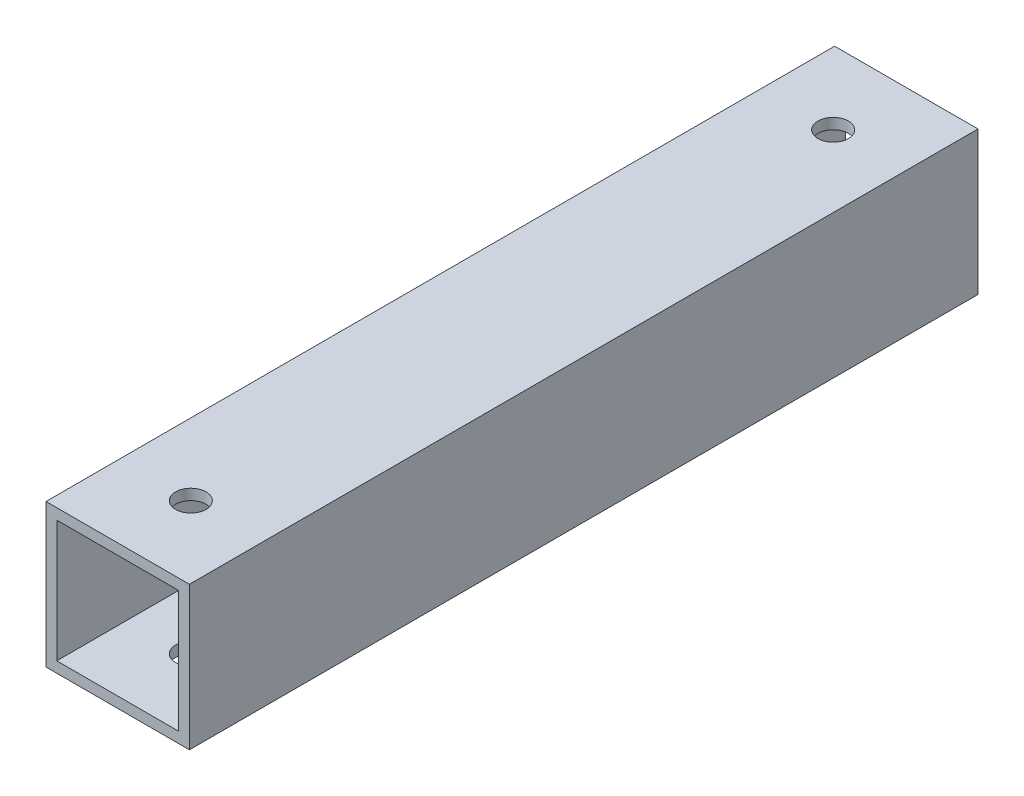
ISO-10303-21;
HEADER;
FILE_DESCRIPTION(('STEP AP214'),'2;1');
FILE_NAME('part.step','',(''),(''),'','','');
FILE_SCHEMA(('AUTOMOTIVE_DESIGN { 1 0 10303 214 1 1 1 1 }'));
ENDSEC;
DATA;
#1=APPLICATION_CONTEXT('core data for automotive mechanical design processes');
#2=APPLICATION_PROTOCOL_DEFINITION('international standard','automotive_design',2000,#1);
#3=PRODUCT_CONTEXT('',#1,'mechanical');
#4=PRODUCT('Part','Part','',(#3));
#5=PRODUCT_RELATED_PRODUCT_CATEGORY('part','',(#4));
#6=PRODUCT_DEFINITION_FORMATION('','',#4);
#7=PRODUCT_DEFINITION_CONTEXT('part definition',#1,'design');
#8=PRODUCT_DEFINITION('design','',#6,#7);
#9=PRODUCT_DEFINITION_SHAPE('','',#8);
#10=(LENGTH_UNIT() NAMED_UNIT(*) SI_UNIT(.MILLI.,.METRE.));
#11=(NAMED_UNIT(*) PLANE_ANGLE_UNIT() SI_UNIT($,.RADIAN.));
#12=(NAMED_UNIT(*) SI_UNIT($,.STERADIAN.) SOLID_ANGLE_UNIT());
#13=UNCERTAINTY_MEASURE_WITH_UNIT(LENGTH_MEASURE(1.E-05),#10,'distance_accuracy_value','');
#14=(GEOMETRIC_REPRESENTATION_CONTEXT(3) GLOBAL_UNCERTAINTY_ASSIGNED_CONTEXT((#13)) GLOBAL_UNIT_ASSIGNED_CONTEXT((#10,
#11,#12)) REPRESENTATION_CONTEXT('',''));
#15=CARTESIAN_POINT('',(0.,0.,0.));
#16=DIRECTION('',(0.,0.,1.));
#17=DIRECTION('',(1.,0.,0.));
#18=AXIS2_PLACEMENT_3D('',#15,#16,#17);
#19=CARTESIAN_POINT('',(10.,-9.99999999999999,-110.));
#20=DIRECTION('',(1.,0.,0.));
#21=DIRECTION('',(0.,0.,-1.));
#22=AXIS2_PLACEMENT_3D('',#19,#20,#21);
#23=PLANE('',#22);
#24=DIRECTION('',(0.,1.,0.));
#25=VECTOR('',#24,1.);
#26=CARTESIAN_POINT('',(10.,-9.99999999999999,0.));
#27=LINE('',#26,#25);
#28=CARTESIAN_POINT('',(10.,-9.99999999999999,0.));
#29=VERTEX_POINT('',#28);
#30=CARTESIAN_POINT('',(10.,10.,0.));
#31=VERTEX_POINT('',#30);
#32=EDGE_CURVE('E142',#29,#31,#27,.T.);
#33=ORIENTED_EDGE('',*,*,#32,.F.);
#34=DIRECTION('',(0.,0.,1.));
#35=VECTOR('',#34,1.);
#36=CARTESIAN_POINT('',(10.,-9.99999999999999,-110.));
#37=LINE('',#36,#35);
#38=CARTESIAN_POINT('',(10.,-9.99999999999999,-110.));
#39=VERTEX_POINT('',#38);
#40=EDGE_CURVE('E11',#39,#29,#37,.T.);
#41=ORIENTED_EDGE('',*,*,#40,.F.);
#42=DIRECTION('',(0.,1.,0.));
#43=VECTOR('',#42,1.);
#44=CARTESIAN_POINT('',(10.,-9.99999999999999,-110.));
#45=LINE('',#44,#43);
#46=CARTESIAN_POINT('',(10.,10.,-110.));
#47=VERTEX_POINT('',#46);
#48=EDGE_CURVE('E146',#39,#47,#45,.T.);
#49=ORIENTED_EDGE('',*,*,#48,.T.);
#50=DIRECTION('',(0.,0.,1.));
#51=VECTOR('',#50,1.);
#52=CARTESIAN_POINT('',(10.,10.,-110.));
#53=LINE('',#52,#51);
#54=EDGE_CURVE('E159',#47,#31,#53,.T.);
#55=ORIENTED_EDGE('',*,*,#54,.T.);
#56=EDGE_LOOP('',(#33,#41,#49,#55));
#57=FACE_BOUND('',#56,.T.);
#58=ADVANCED_FACE('F41',(#57),#23,.T.);
#59=CARTESIAN_POINT('',(-9.99999999999998,-9.99999999999999,-110.));
#60=DIRECTION('',(0.,-1.,0.));
#61=DIRECTION('',(0.,0.,-1.));
#62=AXIS2_PLACEMENT_3D('',#59,#60,#61);
#63=PLANE('',#62);
#64=CARTESIAN_POINT('',(0.,-9.99999999999999,-10.2));
#65=DIRECTION('',(0.,1.,0.));
#66=DIRECTION('',(0.,0.,1.));
#67=AXIS2_PLACEMENT_3D('',#64,#65,#66);
#68=CIRCLE('',#67,2.125);
#69=CARTESIAN_POINT('',(0.,-9.99999999999999,-8.075));
#70=VERTEX_POINT('',#69);
#71=EDGE_CURVE('E176',#70,#70,#68,.T.);
#72=ORIENTED_EDGE('',*,*,#71,.T.);
#73=EDGE_LOOP('',(#72));
#74=FACE_BOUND('',#73,.T.);
#75=CARTESIAN_POINT('',(0.,-9.99999999999999,-99.8));
#76=DIRECTION('',(0.,1.,0.));
#77=DIRECTION('',(0.,0.,-1.));
#78=AXIS2_PLACEMENT_3D('',#75,#76,#77);
#79=CIRCLE('',#78,2.125);
#80=CARTESIAN_POINT('',(0.,-9.99999999999999,-101.925));
#81=VERTEX_POINT('',#80);
#82=EDGE_CURVE('E191',#81,#81,#79,.T.);
#83=ORIENTED_EDGE('',*,*,#82,.T.);
#84=EDGE_LOOP('',(#83));
#85=FACE_BOUND('',#84,.T.);
#86=DIRECTION('',(1.,0.,0.));
#87=VECTOR('',#86,1.);
#88=CARTESIAN_POINT('',(-9.99999999999998,-9.99999999999999,0.));
#89=LINE('',#88,#87);
#90=CARTESIAN_POINT('',(-9.99999999999998,-9.99999999999999,0.));
#91=VERTEX_POINT('',#90);
#92=EDGE_CURVE('E150',#91,#29,#89,.T.);
#93=ORIENTED_EDGE('',*,*,#92,.F.);
#94=DIRECTION('',(0.,0.,1.));
#95=VECTOR('',#94,1.);
#96=CARTESIAN_POINT('',(-9.99999999999998,-9.99999999999999,-110.));
#97=LINE('',#96,#95);
#98=CARTESIAN_POINT('',(-9.99999999999998,-9.99999999999999,-110.));
#99=VERTEX_POINT('',#98);
#100=EDGE_CURVE('E49',#99,#91,#97,.T.);
#101=ORIENTED_EDGE('',*,*,#100,.F.);
#102=DIRECTION('',(1.,0.,0.));
#103=VECTOR('',#102,1.);
#104=CARTESIAN_POINT('',(-9.99999999999998,-9.99999999999999,-110.));
#105=LINE('',#104,#103);
#106=EDGE_CURVE('E156',#99,#39,#105,.T.);
#107=ORIENTED_EDGE('',*,*,#106,.T.);
#108=ORIENTED_EDGE('',*,*,#40,.T.);
#109=EDGE_LOOP('',(#93,#101,#107,#108));
#110=FACE_BOUND('',#109,.T.);
#111=ADVANCED_FACE('F195',(#74,#85,#110),#63,.T.);
#112=CARTESIAN_POINT('',(-9.99999999999998,-9.99999999999999,-110.));
#113=DIRECTION('',(-1.,0.,0.));
#114=DIRECTION('',(0.,0.,1.));
#115=AXIS2_PLACEMENT_3D('',#112,#113,#114);
#116=PLANE('',#115);
#117=DIRECTION('',(0.,-1.,0.));
#118=VECTOR('',#117,1.);
#119=CARTESIAN_POINT('',(-9.99999999999998,-9.99999999999999,0.));
#120=LINE('',#119,#118);
#121=CARTESIAN_POINT('',(-9.99999999999998,10.,0.));
#122=VERTEX_POINT('',#121);
#123=EDGE_CURVE('E165',#122,#91,#120,.T.);
#124=ORIENTED_EDGE('',*,*,#123,.F.);
#125=DIRECTION('',(0.,0.,1.));
#126=VECTOR('',#125,1.);
#127=CARTESIAN_POINT('',(-9.99999999999998,10.,-110.));
#128=LINE('',#127,#126);
#129=CARTESIAN_POINT('',(-9.99999999999998,10.,-110.));
#130=VERTEX_POINT('',#129);
#131=EDGE_CURVE('E171',#130,#122,#128,.T.);
#132=ORIENTED_EDGE('',*,*,#131,.F.);
#133=DIRECTION('',(0.,-1.,0.));
#134=VECTOR('',#133,1.);
#135=CARTESIAN_POINT('',(-9.99999999999998,-9.99999999999999,-110.));
#136=LINE('',#135,#134);
#137=EDGE_CURVE('E153',#130,#99,#136,.T.);
#138=ORIENTED_EDGE('',*,*,#137,.T.);
#139=ORIENTED_EDGE('',*,*,#100,.T.);
#140=EDGE_LOOP('',(#124,#132,#138,#139));
#141=FACE_BOUND('',#140,.T.);
#142=ADVANCED_FACE('F223',(#141),#116,.T.);
#143=CARTESIAN_POINT('',(-9.99999999999998,10.,-110.));
#144=DIRECTION('',(0.,1.,0.));
#145=DIRECTION('',(0.,0.,1.));
#146=AXIS2_PLACEMENT_3D('',#143,#144,#145);
#147=PLANE('',#146);
#148=CARTESIAN_POINT('',(0.,10.,-10.2));
#149=DIRECTION('',(0.,1.,0.));
#150=DIRECTION('',(0.,0.,1.));
#151=AXIS2_PLACEMENT_3D('',#148,#149,#150);
#152=CIRCLE('',#151,2.125);
#153=CARTESIAN_POINT('',(0.,10.,-8.075));
#154=VERTEX_POINT('',#153);
#155=EDGE_CURVE('E181',#154,#154,#152,.T.);
#156=ORIENTED_EDGE('',*,*,#155,.F.);
#157=EDGE_LOOP('',(#156));
#158=FACE_BOUND('',#157,.T.);
#159=CARTESIAN_POINT('',(0.,10.,-99.8));
#160=DIRECTION('',(0.,1.,0.));
#161=DIRECTION('',(0.,0.,-1.));
#162=AXIS2_PLACEMENT_3D('',#159,#160,#161);
#163=CIRCLE('',#162,2.125);
#164=CARTESIAN_POINT('',(0.,10.,-101.925));
#165=VERTEX_POINT('',#164);
#166=EDGE_CURVE('E186',#165,#165,#163,.T.);
#167=ORIENTED_EDGE('',*,*,#166,.F.);
#168=EDGE_LOOP('',(#167));
#169=FACE_BOUND('',#168,.T.);
#170=DIRECTION('',(-1.,0.,0.));
#171=VECTOR('',#170,1.);
#172=CARTESIAN_POINT('',(-9.99999999999998,10.,0.));
#173=LINE('',#172,#171);
#174=EDGE_CURVE('E162',#31,#122,#173,.T.);
#175=ORIENTED_EDGE('',*,*,#174,.F.);
#176=ORIENTED_EDGE('',*,*,#54,.F.);
#177=DIRECTION('',(-1.,0.,0.));
#178=VECTOR('',#177,1.);
#179=CARTESIAN_POINT('',(-9.99999999999998,10.,-110.));
#180=LINE('',#179,#178);
#181=EDGE_CURVE('E149',#47,#130,#180,.T.);
#182=ORIENTED_EDGE('',*,*,#181,.T.);
#183=ORIENTED_EDGE('',*,*,#131,.T.);
#184=EDGE_LOOP('',(#175,#176,#182,#183));
#185=FACE_BOUND('',#184,.T.);
#186=ADVANCED_FACE('F236',(#158,#169,#185),#147,.T.);
#187=CARTESIAN_POINT('',(0.,0.,-110.));
#188=DIRECTION('',(0.,0.,-1.));
#189=DIRECTION('',(-1.,0.,0.));
#190=AXIS2_PLACEMENT_3D('',#187,#188,#189);
#191=PLANE('',#190);
#192=DIRECTION('',(0.,-1.,0.));
#193=VECTOR('',#192,1.);
#194=CARTESIAN_POINT('',(-8.49999999999998,-8.49999999999999,-110.));
#195=LINE('',#194,#193);
#196=CARTESIAN_POINT('',(-8.49999999999998,8.50000000000002,-110.));
#197=VERTEX_POINT('',#196);
#198=CARTESIAN_POINT('',(-8.49999999999998,-8.49999999999999,-110.));
#199=VERTEX_POINT('',#198);
#200=EDGE_CURVE('E108',#197,#199,#195,.T.);
#201=ORIENTED_EDGE('',*,*,#200,.T.);
#202=DIRECTION('',(1.,0.,0.));
#203=VECTOR('',#202,1.);
#204=CARTESIAN_POINT('',(-8.49999999999998,-8.49999999999999,-110.));
#205=LINE('',#204,#203);
#206=CARTESIAN_POINT('',(8.50000000000002,-8.49999999999999,-110.));
#207=VERTEX_POINT('',#206);
#208=EDGE_CURVE('E117',#199,#207,#205,.T.);
#209=ORIENTED_EDGE('',*,*,#208,.T.);
#210=DIRECTION('',(0.,1.,0.));
#211=VECTOR('',#210,1.);
#212=CARTESIAN_POINT('',(8.50000000000002,-8.49999999999999,-110.));
#213=LINE('',#212,#211);
#214=CARTESIAN_POINT('',(8.50000000000002,8.50000000000002,-110.));
#215=VERTEX_POINT('',#214);
#216=EDGE_CURVE('E57',#207,#215,#213,.T.);
#217=ORIENTED_EDGE('',*,*,#216,.T.);
#218=DIRECTION('',(-1.,0.,0.));
#219=VECTOR('',#218,1.);
#220=CARTESIAN_POINT('',(-8.49999999999998,8.50000000000002,-110.));
#221=LINE('',#220,#219);
#222=EDGE_CURVE('E114',#215,#197,#221,.T.);
#223=ORIENTED_EDGE('',*,*,#222,.T.);
#224=EDGE_LOOP('',(#201,#209,#217,#223));
#225=FACE_BOUND('',#224,.T.);
#226=ORIENTED_EDGE('',*,*,#48,.F.);
#227=ORIENTED_EDGE('',*,*,#106,.F.);
#228=ORIENTED_EDGE('',*,*,#137,.F.);
#229=ORIENTED_EDGE('',*,*,#181,.F.);
#230=EDGE_LOOP('',(#226,#227,#228,#229));
#231=FACE_BOUND('',#230,.T.);
#232=ADVANCED_FACE('F121',(#225,#231),#191,.T.);
#233=CARTESIAN_POINT('',(0.,0.,0.));
#234=DIRECTION('',(0.,0.,-1.));
#235=DIRECTION('',(-1.,0.,0.));
#236=AXIS2_PLACEMENT_3D('',#233,#234,#235);
#237=PLANE('',#236);
#238=DIRECTION('',(1.,0.,0.));
#239=VECTOR('',#238,1.);
#240=CARTESIAN_POINT('',(-8.49999999999998,-8.49999999999999,0.));
#241=LINE('',#240,#239);
#242=CARTESIAN_POINT('',(-8.49999999999998,-8.49999999999999,0.));
#243=VERTEX_POINT('',#242);
#244=CARTESIAN_POINT('',(8.50000000000002,-8.49999999999999,0.));
#245=VERTEX_POINT('',#244);
#246=EDGE_CURVE('E136',#243,#245,#241,.T.);
#247=ORIENTED_EDGE('',*,*,#246,.F.);
#248=DIRECTION('',(0.,-1.,0.));
#249=VECTOR('',#248,1.);
#250=CARTESIAN_POINT('',(-8.49999999999998,-8.49999999999999,0.));
#251=LINE('',#250,#249);
#252=CARTESIAN_POINT('',(-8.49999999999998,8.50000000000002,0.));
#253=VERTEX_POINT('',#252);
#254=EDGE_CURVE('E65',#253,#243,#251,.T.);
#255=ORIENTED_EDGE('',*,*,#254,.F.);
#256=DIRECTION('',(-1.,0.,0.));
#257=VECTOR('',#256,1.);
#258=CARTESIAN_POINT('',(-8.49999999999998,8.50000000000002,0.));
#259=LINE('',#258,#257);
#260=CARTESIAN_POINT('',(8.50000000000002,8.50000000000002,0.));
#261=VERTEX_POINT('',#260);
#262=EDGE_CURVE('E124',#261,#253,#259,.T.);
#263=ORIENTED_EDGE('',*,*,#262,.F.);
#264=DIRECTION('',(0.,1.,0.));
#265=VECTOR('',#264,1.);
#266=CARTESIAN_POINT('',(8.50000000000002,-8.49999999999999,0.));
#267=LINE('',#266,#265);
#268=EDGE_CURVE('E127',#245,#261,#267,.T.);
#269=ORIENTED_EDGE('',*,*,#268,.F.);
#270=EDGE_LOOP('',(#247,#255,#263,#269));
#271=FACE_BOUND('',#270,.T.);
#272=ORIENTED_EDGE('',*,*,#32,.T.);
#273=ORIENTED_EDGE('',*,*,#174,.T.);
#274=ORIENTED_EDGE('',*,*,#123,.T.);
#275=ORIENTED_EDGE('',*,*,#92,.T.);
#276=EDGE_LOOP('',(#272,#273,#274,#275));
#277=FACE_BOUND('',#276,.T.);
#278=ADVANCED_FACE('F230',(#271,#277),#237,.F.);
#279=CARTESIAN_POINT('',(-8.49999999999998,-8.49999999999999,-110.));
#280=DIRECTION('',(-1.,0.,0.));
#281=DIRECTION('',(0.,0.,1.));
#282=AXIS2_PLACEMENT_3D('',#279,#280,#281);
#283=PLANE('',#282);
#284=ORIENTED_EDGE('',*,*,#254,.T.);
#285=DIRECTION('',(0.,0.,1.));
#286=VECTOR('',#285,1.);
#287=CARTESIAN_POINT('',(-8.49999999999998,-8.49999999999999,-110.));
#288=LINE('',#287,#286);
#289=EDGE_CURVE('E104',#199,#243,#288,.T.);
#290=ORIENTED_EDGE('',*,*,#289,.F.);
#291=ORIENTED_EDGE('',*,*,#200,.F.);
#292=DIRECTION('',(0.,0.,1.));
#293=VECTOR('',#292,1.);
#294=CARTESIAN_POINT('',(-8.49999999999998,8.50000000000002,-110.));
#295=LINE('',#294,#293);
#296=EDGE_CURVE('E140',#197,#253,#295,.T.);
#297=ORIENTED_EDGE('',*,*,#296,.T.);
#298=EDGE_LOOP('',(#284,#290,#291,#297));
#299=FACE_BOUND('',#298,.T.);
#300=ADVANCED_FACE('F106',(#299),#283,.F.);
#301=CARTESIAN_POINT('',(-8.49999999999998,8.50000000000002,-110.));
#302=DIRECTION('',(0.,1.,0.));
#303=DIRECTION('',(0.,0.,1.));
#304=AXIS2_PLACEMENT_3D('',#301,#302,#303);
#305=PLANE('',#304);
#306=CARTESIAN_POINT('',(0.,8.50000000000002,-10.2));
#307=DIRECTION('',(0.,1.,0.));
#308=DIRECTION('',(0.,0.,1.));
#309=AXIS2_PLACEMENT_3D('',#306,#307,#308);
#310=CIRCLE('',#309,2.125);
#311=CARTESIAN_POINT('',(0.,8.50000000000002,-8.075));
#312=VERTEX_POINT('',#311);
#313=EDGE_CURVE('E130',#312,#312,#310,.T.);
#314=ORIENTED_EDGE('',*,*,#313,.T.);
#315=EDGE_LOOP('',(#314));
#316=FACE_BOUND('',#315,.T.);
#317=CARTESIAN_POINT('',(0.,8.50000000000002,-99.8));
#318=DIRECTION('',(0.,1.,0.));
#319=DIRECTION('',(0.,0.,1.));
#320=AXIS2_PLACEMENT_3D('',#317,#318,#319);
#321=CIRCLE('',#320,2.125);
#322=CARTESIAN_POINT('',(0.,8.50000000000002,-97.675));
#323=VERTEX_POINT('',#322);
#324=EDGE_CURVE('E175',#323,#323,#321,.T.);
#325=ORIENTED_EDGE('',*,*,#324,.T.);
#326=EDGE_LOOP('',(#325));
#327=FACE_BOUND('',#326,.T.);
#328=ORIENTED_EDGE('',*,*,#262,.T.);
#329=ORIENTED_EDGE('',*,*,#296,.F.);
#330=ORIENTED_EDGE('',*,*,#222,.F.);
#331=DIRECTION('',(0.,0.,1.));
#332=VECTOR('',#331,1.);
#333=CARTESIAN_POINT('',(8.50000000000002,8.50000000000002,-110.));
#334=LINE('',#333,#332);
#335=EDGE_CURVE('E143',#215,#261,#334,.T.);
#336=ORIENTED_EDGE('',*,*,#335,.T.);
#337=EDGE_LOOP('',(#328,#329,#330,#336));
#338=FACE_BOUND('',#337,.T.);
#339=ADVANCED_FACE('F250',(#316,#327,#338),#305,.F.);
#340=CARTESIAN_POINT('',(8.50000000000002,-8.49999999999999,-110.));
#341=DIRECTION('',(1.,0.,0.));
#342=DIRECTION('',(0.,0.,-1.));
#343=AXIS2_PLACEMENT_3D('',#340,#341,#342);
#344=PLANE('',#343);
#345=ORIENTED_EDGE('',*,*,#268,.T.);
#346=ORIENTED_EDGE('',*,*,#335,.F.);
#347=ORIENTED_EDGE('',*,*,#216,.F.);
#348=DIRECTION('',(0.,0.,1.));
#349=VECTOR('',#348,1.);
#350=CARTESIAN_POINT('',(8.50000000000002,-8.49999999999999,-110.));
#351=LINE('',#350,#349);
#352=EDGE_CURVE('E113',#207,#245,#351,.T.);
#353=ORIENTED_EDGE('',*,*,#352,.T.);
#354=EDGE_LOOP('',(#345,#346,#347,#353));
#355=FACE_BOUND('',#354,.T.);
#356=ADVANCED_FACE('F211',(#355),#344,.F.);
#357=CARTESIAN_POINT('',(-8.49999999999998,-8.49999999999999,-110.));
#358=DIRECTION('',(0.,-1.,0.));
#359=DIRECTION('',(0.,0.,-1.));
#360=AXIS2_PLACEMENT_3D('',#357,#358,#359);
#361=PLANE('',#360);
#362=CARTESIAN_POINT('',(0.,-8.49999999999999,-10.2));
#363=DIRECTION('',(0.,-1.,0.));
#364=DIRECTION('',(0.,0.,-1.));
#365=AXIS2_PLACEMENT_3D('',#362,#363,#364);
#366=CIRCLE('',#365,2.125);
#367=CARTESIAN_POINT('',(0.,-8.49999999999999,-12.325));
#368=VERTEX_POINT('',#367);
#369=EDGE_CURVE('E44',#368,#368,#366,.T.);
#370=ORIENTED_EDGE('',*,*,#369,.T.);
#371=EDGE_LOOP('',(#370));
#372=FACE_BOUND('',#371,.T.);
#373=CARTESIAN_POINT('',(0.,-8.49999999999999,-99.8));
#374=DIRECTION('',(0.,-1.,0.));
#375=DIRECTION('',(0.,0.,-1.));
#376=AXIS2_PLACEMENT_3D('',#373,#374,#375);
#377=CIRCLE('',#376,2.125);
#378=CARTESIAN_POINT('',(0.,-8.49999999999999,-101.925));
#379=VERTEX_POINT('',#378);
#380=EDGE_CURVE('E173',#379,#379,#377,.T.);
#381=ORIENTED_EDGE('',*,*,#380,.T.);
#382=EDGE_LOOP('',(#381));
#383=FACE_BOUND('',#382,.T.);
#384=ORIENTED_EDGE('',*,*,#246,.T.);
#385=ORIENTED_EDGE('',*,*,#352,.F.);
#386=ORIENTED_EDGE('',*,*,#208,.F.);
#387=ORIENTED_EDGE('',*,*,#289,.T.);
#388=EDGE_LOOP('',(#384,#385,#386,#387));
#389=FACE_BOUND('',#388,.T.);
#390=ADVANCED_FACE('F118',(#372,#383,#389),#361,.F.);
#391=CARTESIAN_POINT('',(0.,-9.99999999999999,-99.8));
#392=DIRECTION('',(0.,1.,0.));
#393=DIRECTION('',(0.,0.,1.));
#394=AXIS2_PLACEMENT_3D('',#391,#392,#393);
#395=CYLINDRICAL_SURFACE('',#394,2.125);
#396=ORIENTED_EDGE('',*,*,#82,.F.);
#397=EDGE_LOOP('',(#396));
#398=FACE_BOUND('',#397,.T.);
#399=ORIENTED_EDGE('',*,*,#380,.F.);
#400=EDGE_LOOP('',(#399));
#401=FACE_BOUND('',#400,.T.);
#402=ADVANCED_FACE('F198',(#398,#401),#395,.F.);
#403=CARTESIAN_POINT('',(0.,-9.99999999999999,-10.2));
#404=DIRECTION('',(0.,1.,0.));
#405=DIRECTION('',(0.,0.,1.));
#406=AXIS2_PLACEMENT_3D('',#403,#404,#405);
#407=CYLINDRICAL_SURFACE('',#406,2.125);
#408=ORIENTED_EDGE('',*,*,#71,.F.);
#409=EDGE_LOOP('',(#408));
#410=FACE_BOUND('',#409,.T.);
#411=ORIENTED_EDGE('',*,*,#369,.F.);
#412=EDGE_LOOP('',(#411));
#413=FACE_BOUND('',#412,.T.);
#414=ADVANCED_FACE('F201',(#410,#413),#407,.F.);
#415=ORIENTED_EDGE('',*,*,#166,.T.);
#416=EDGE_LOOP('',(#415));
#417=FACE_BOUND('',#416,.T.);
#418=ORIENTED_EDGE('',*,*,#324,.F.);
#419=EDGE_LOOP('',(#418));
#420=FACE_BOUND('',#419,.T.);
#421=ADVANCED_FACE('F203',(#417,#420),#395,.F.);
#422=ORIENTED_EDGE('',*,*,#155,.T.);
#423=EDGE_LOOP('',(#422));
#424=FACE_BOUND('',#423,.T.);
#425=ORIENTED_EDGE('',*,*,#313,.F.);
#426=EDGE_LOOP('',(#425));
#427=FACE_BOUND('',#426,.T.);
#428=ADVANCED_FACE('F210',(#424,#427),#407,.F.);
#429=CLOSED_SHELL('',(#58,#111,#142,#186,#232,#278,#300,#339,#356,#390,#402,#414,#421,#428));
#430=MANIFOLD_SOLID_BREP('B2',#429);
#431=ADVANCED_BREP_SHAPE_REPRESENTATION('',(#18,#430),#14);
#432=SHAPE_DEFINITION_REPRESENTATION(#9,#431);
ENDSEC;
END-ISO-10303-21;
